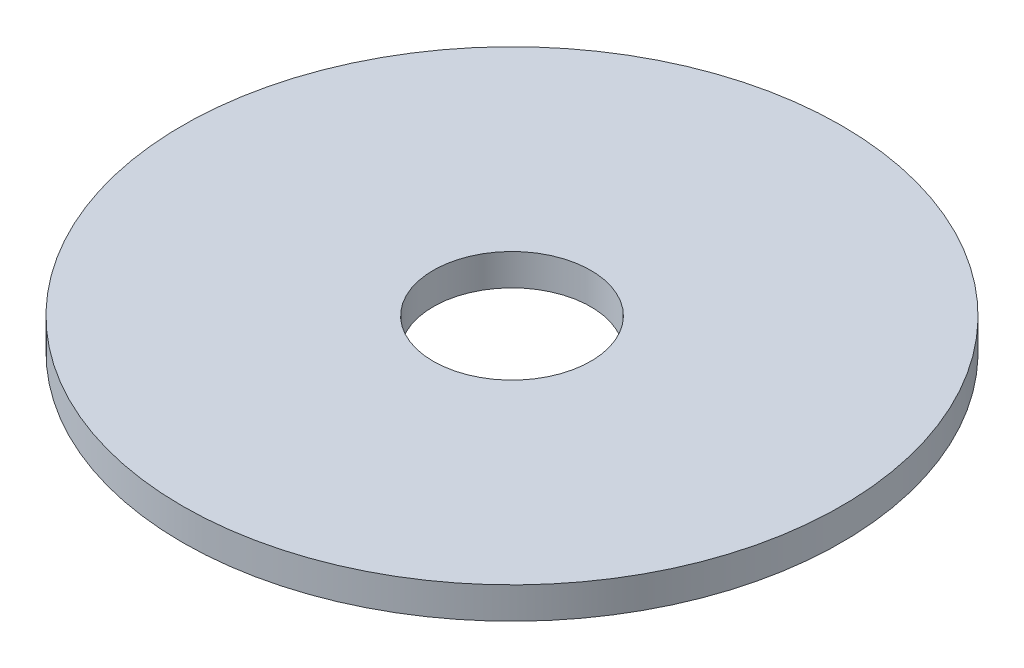
ISO-10303-21;
HEADER;
FILE_DESCRIPTION(('STEP AP214'),'2;1');
FILE_NAME('part.step','',(''),(''),'','','');
FILE_SCHEMA(('AUTOMOTIVE_DESIGN { 1 0 10303 214 1 1 1 1 }'));
ENDSEC;
DATA;
#1=APPLICATION_CONTEXT('core data for automotive mechanical design processes');
#2=APPLICATION_PROTOCOL_DEFINITION('international standard','automotive_design',2000,#1);
#3=PRODUCT_CONTEXT('',#1,'mechanical');
#4=PRODUCT('Part','Part','',(#3));
#5=PRODUCT_RELATED_PRODUCT_CATEGORY('part','',(#4));
#6=PRODUCT_DEFINITION_FORMATION('','',#4);
#7=PRODUCT_DEFINITION_CONTEXT('part definition',#1,'design');
#8=PRODUCT_DEFINITION('design','',#6,#7);
#9=PRODUCT_DEFINITION_SHAPE('','',#8);
#10=(LENGTH_UNIT() NAMED_UNIT(*) SI_UNIT(.MILLI.,.METRE.));
#11=(NAMED_UNIT(*) PLANE_ANGLE_UNIT() SI_UNIT($,.RADIAN.));
#12=(NAMED_UNIT(*) SI_UNIT($,.STERADIAN.) SOLID_ANGLE_UNIT());
#13=UNCERTAINTY_MEASURE_WITH_UNIT(LENGTH_MEASURE(1.E-05),#10,'distance_accuracy_value','');
#14=(GEOMETRIC_REPRESENTATION_CONTEXT(3) GLOBAL_UNCERTAINTY_ASSIGNED_CONTEXT((#13)) GLOBAL_UNIT_ASSIGNED_CONTEXT((#10,
#11,#12)) REPRESENTATION_CONTEXT('',''));
#15=CARTESIAN_POINT('',(0.,0.,0.));
#16=DIRECTION('',(0.,0.,1.));
#17=DIRECTION('',(1.,0.,0.));
#18=AXIS2_PLACEMENT_3D('',#15,#16,#17);
#19=CARTESIAN_POINT('',(0.,10.,0.));
#20=DIRECTION('',(0.,1.,0.));
#21=DIRECTION('',(0.,0.,1.));
#22=AXIS2_PLACEMENT_3D('',#19,#20,#21);
#23=PLANE('',#22);
#24=CARTESIAN_POINT('',(0.,10.,0.));
#25=DIRECTION('',(0.,1.,0.));
#26=DIRECTION('',(0.,0.,1.));
#27=AXIS2_PLACEMENT_3D('',#24,#25,#26);
#28=CIRCLE('',#27,104.55);
#29=CARTESIAN_POINT('',(0.,10.,104.55));
#30=VERTEX_POINT('',#29);
#31=EDGE_CURVE('E10',#30,#30,#28,.T.);
#32=ORIENTED_EDGE('',*,*,#31,.T.);
#33=EDGE_LOOP('',(#32));
#34=FACE_BOUND('',#33,.T.);
#35=CARTESIAN_POINT('',(0.,10.,0.));
#36=DIRECTION('',(0.,1.,0.));
#37=DIRECTION('',(0.,0.,1.));
#38=AXIS2_PLACEMENT_3D('',#35,#36,#37);
#39=CIRCLE('',#38,25.);
#40=CARTESIAN_POINT('',(0.,10.,25.));
#41=VERTEX_POINT('',#40);
#42=EDGE_CURVE('E47',#41,#41,#39,.T.);
#43=ORIENTED_EDGE('',*,*,#42,.F.);
#44=EDGE_LOOP('',(#43));
#45=FACE_BOUND('',#44,.T.);
#46=ADVANCED_FACE('F33',(#34,#45),#23,.T.);
#47=CARTESIAN_POINT('',(0.,0.,0.));
#48=DIRECTION('',(0.,1.,0.));
#49=DIRECTION('',(0.,0.,1.));
#50=AXIS2_PLACEMENT_3D('',#47,#48,#49);
#51=PLANE('',#50);
#52=CARTESIAN_POINT('',(0.,0.,0.));
#53=DIRECTION('',(0.,1.,0.));
#54=DIRECTION('',(0.,0.,1.));
#55=AXIS2_PLACEMENT_3D('',#52,#53,#54);
#56=CIRCLE('',#55,104.55);
#57=CARTESIAN_POINT('',(0.,0.,104.55));
#58=VERTEX_POINT('',#57);
#59=EDGE_CURVE('E37',#58,#58,#56,.T.);
#60=ORIENTED_EDGE('',*,*,#59,.F.);
#61=EDGE_LOOP('',(#60));
#62=FACE_BOUND('',#61,.T.);
#63=CARTESIAN_POINT('',(0.,0.,0.));
#64=DIRECTION('',(0.,1.,0.));
#65=DIRECTION('',(0.,0.,1.));
#66=AXIS2_PLACEMENT_3D('',#63,#64,#65);
#67=CIRCLE('',#66,25.);
#68=CARTESIAN_POINT('',(0.,0.,25.));
#69=VERTEX_POINT('',#68);
#70=EDGE_CURVE('E49',#69,#69,#67,.T.);
#71=ORIENTED_EDGE('',*,*,#70,.T.);
#72=EDGE_LOOP('',(#71));
#73=FACE_BOUND('',#72,.T.);
#74=ADVANCED_FACE('F62',(#62,#73),#51,.F.);
#75=CARTESIAN_POINT('',(0.,10.,0.));
#76=DIRECTION('',(0.,-1.,0.));
#77=DIRECTION('',(0.,0.,-1.));
#78=AXIS2_PLACEMENT_3D('',#75,#76,#77);
#79=CYLINDRICAL_SURFACE('',#78,104.55);
#80=ORIENTED_EDGE('',*,*,#31,.F.);
#81=EDGE_LOOP('',(#80));
#82=FACE_BOUND('',#81,.T.);
#83=ORIENTED_EDGE('',*,*,#59,.T.);
#84=EDGE_LOOP('',(#83));
#85=FACE_BOUND('',#84,.T.);
#86=ADVANCED_FACE('F35',(#82,#85),#79,.T.);
#87=CARTESIAN_POINT('',(0.,10.,0.));
#88=DIRECTION('',(0.,-1.,0.));
#89=DIRECTION('',(0.,0.,-1.));
#90=AXIS2_PLACEMENT_3D('',#87,#88,#89);
#91=CYLINDRICAL_SURFACE('',#90,25.);
#92=ORIENTED_EDGE('',*,*,#42,.T.);
#93=EDGE_LOOP('',(#92));
#94=FACE_BOUND('',#93,.T.);
#95=ORIENTED_EDGE('',*,*,#70,.F.);
#96=EDGE_LOOP('',(#95));
#97=FACE_BOUND('',#96,.T.);
#98=ADVANCED_FACE('F58',(#94,#97),#91,.F.);
#99=CLOSED_SHELL('',(#46,#74,#86,#98));
#100=MANIFOLD_SOLID_BREP('B2',#99);
#101=ADVANCED_BREP_SHAPE_REPRESENTATION('',(#18,#100),#14);
#102=SHAPE_DEFINITION_REPRESENTATION(#9,#101);
ENDSEC;
END-ISO-10303-21;
